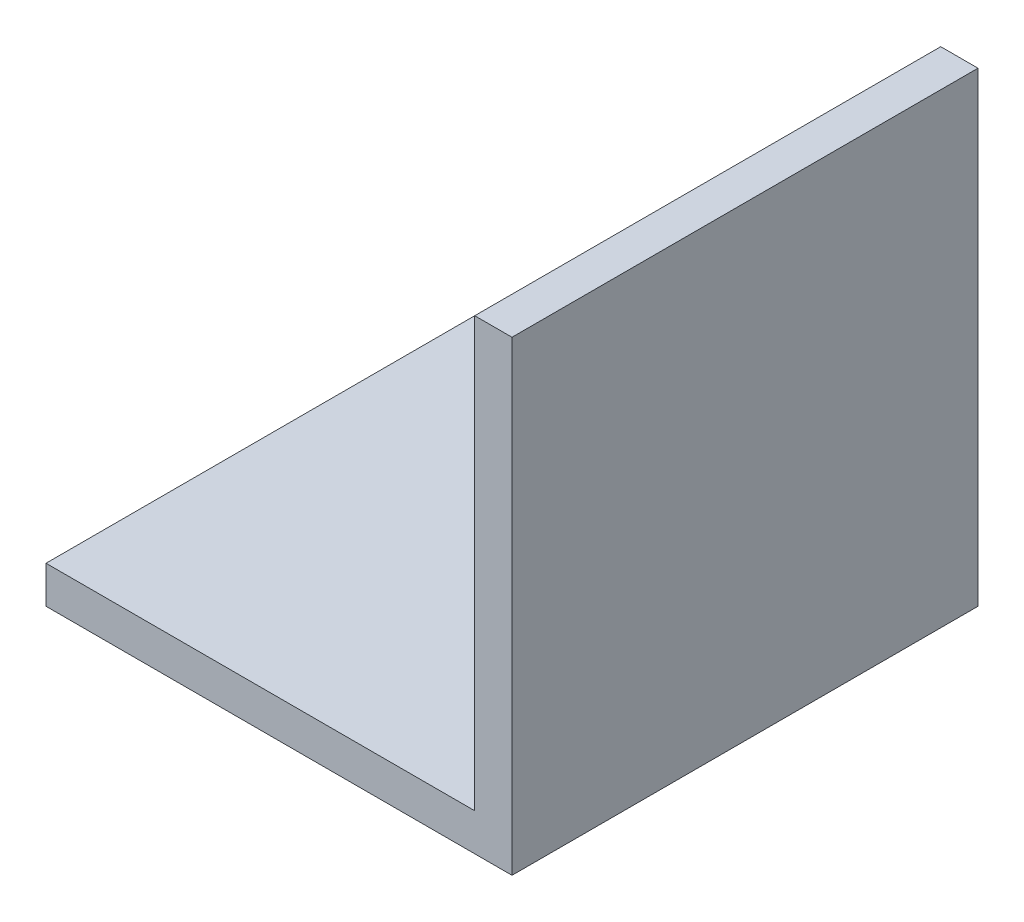
ISO-10303-21;
HEADER;
FILE_DESCRIPTION(('STEP AP214'),'2;1');
FILE_NAME('part.step','',(''),(''),'','','');
FILE_SCHEMA(('AUTOMOTIVE_DESIGN { 1 0 10303 214 1 1 1 1 }'));
ENDSEC;
DATA;
#1=APPLICATION_CONTEXT('core data for automotive mechanical design processes');
#2=APPLICATION_PROTOCOL_DEFINITION('international standard','automotive_design',2000,#1);
#3=PRODUCT_CONTEXT('',#1,'mechanical');
#4=PRODUCT('Part','Part','',(#3));
#5=PRODUCT_RELATED_PRODUCT_CATEGORY('part','',(#4));
#6=PRODUCT_DEFINITION_FORMATION('','',#4);
#7=PRODUCT_DEFINITION_CONTEXT('part definition',#1,'design');
#8=PRODUCT_DEFINITION('design','',#6,#7);
#9=PRODUCT_DEFINITION_SHAPE('','',#8);
#10=(LENGTH_UNIT() NAMED_UNIT(*) SI_UNIT(.MILLI.,.METRE.));
#11=(NAMED_UNIT(*) PLANE_ANGLE_UNIT() SI_UNIT($,.RADIAN.));
#12=(NAMED_UNIT(*) SI_UNIT($,.STERADIAN.) SOLID_ANGLE_UNIT());
#13=UNCERTAINTY_MEASURE_WITH_UNIT(LENGTH_MEASURE(1.E-05),#10,'distance_accuracy_value','');
#14=(GEOMETRIC_REPRESENTATION_CONTEXT(3) GLOBAL_UNCERTAINTY_ASSIGNED_CONTEXT((#13)) GLOBAL_UNIT_ASSIGNED_CONTEXT((#10,
#11,#12)) REPRESENTATION_CONTEXT('',''));
#15=CARTESIAN_POINT('',(0.,0.,0.));
#16=DIRECTION('',(0.,0.,1.));
#17=DIRECTION('',(1.,0.,0.));
#18=AXIS2_PLACEMENT_3D('',#15,#16,#17);
#19=CARTESIAN_POINT('',(-34.4284761465778,-3.38361242304211,50.));
#20=DIRECTION('',(1.,0.,0.));
#21=DIRECTION('',(0.,0.,-1.));
#22=AXIS2_PLACEMENT_3D('',#19,#20,#21);
#23=PLANE('',#22);
#24=DIRECTION('',(0.,-1.,0.));
#25=VECTOR('',#24,1.);
#26=CARTESIAN_POINT('',(-34.4284761465778,-3.38361242304211,0.));
#27=LINE('',#26,#25);
#28=CARTESIAN_POINT('',(-34.4284761465778,-3.38361242304211,0.));
#29=VERTEX_POINT('',#28);
#30=CARTESIAN_POINT('',(-34.4284761465778,-7.3836124230421,0.));
#31=VERTEX_POINT('',#30);
#32=EDGE_CURVE('E134',#29,#31,#27,.T.);
#33=ORIENTED_EDGE('',*,*,#32,.T.);
#34=DIRECTION('',(0.,0.,-1.));
#35=VECTOR('',#34,1.);
#36=CARTESIAN_POINT('',(-34.4284761465778,-7.3836124230421,50.));
#37=LINE('',#36,#35);
#38=CARTESIAN_POINT('',(-34.4284761465778,-7.3836124230421,50.));
#39=VERTEX_POINT('',#38);
#40=EDGE_CURVE('E11',#39,#31,#37,.T.);
#41=ORIENTED_EDGE('',*,*,#40,.F.);
#42=DIRECTION('',(0.,-1.,0.));
#43=VECTOR('',#42,1.);
#44=CARTESIAN_POINT('',(-34.4284761465778,-3.38361242304211,50.));
#45=LINE('',#44,#43);
#46=CARTESIAN_POINT('',(-34.4284761465778,-3.38361242304211,50.));
#47=VERTEX_POINT('',#46);
#48=EDGE_CURVE('E150',#47,#39,#45,.T.);
#49=ORIENTED_EDGE('',*,*,#48,.F.);
#50=DIRECTION('',(0.,0.,-1.));
#51=VECTOR('',#50,1.);
#52=CARTESIAN_POINT('',(-34.4284761465778,-3.38361242304211,50.));
#53=LINE('',#52,#51);
#54=EDGE_CURVE('E130',#47,#29,#53,.T.);
#55=ORIENTED_EDGE('',*,*,#54,.T.);
#56=EDGE_LOOP('',(#33,#41,#49,#55));
#57=FACE_BOUND('',#56,.T.);
#58=ADVANCED_FACE('F45',(#57),#23,.F.);
#59=CARTESIAN_POINT('',(-34.4284761465778,-7.3836124230421,50.));
#60=DIRECTION('',(0.,1.,0.));
#61=DIRECTION('',(0.,0.,1.));
#62=AXIS2_PLACEMENT_3D('',#59,#60,#61);
#63=PLANE('',#62);
#64=DIRECTION('',(1.,0.,0.));
#65=VECTOR('',#64,1.);
#66=CARTESIAN_POINT('',(-34.4284761465778,-7.3836124230421,0.));
#67=LINE('',#66,#65);
#68=CARTESIAN_POINT('',(15.5715238534222,-7.3836124230421,0.));
#69=VERTEX_POINT('',#68);
#70=EDGE_CURVE('E138',#31,#69,#67,.T.);
#71=ORIENTED_EDGE('',*,*,#70,.T.);
#72=DIRECTION('',(0.,0.,-1.));
#73=VECTOR('',#72,1.);
#74=CARTESIAN_POINT('',(15.5715238534222,-7.3836124230421,50.));
#75=LINE('',#74,#73);
#76=CARTESIAN_POINT('',(15.5715238534222,-7.3836124230421,50.));
#77=VERTEX_POINT('',#76);
#78=EDGE_CURVE('E54',#77,#69,#75,.T.);
#79=ORIENTED_EDGE('',*,*,#78,.F.);
#80=DIRECTION('',(1.,0.,0.));
#81=VECTOR('',#80,1.);
#82=CARTESIAN_POINT('',(-34.4284761465778,-7.3836124230421,50.));
#83=LINE('',#82,#81);
#84=EDGE_CURVE('E99',#39,#77,#83,.T.);
#85=ORIENTED_EDGE('',*,*,#84,.F.);
#86=ORIENTED_EDGE('',*,*,#40,.T.);
#87=EDGE_LOOP('',(#71,#79,#85,#86));
#88=FACE_BOUND('',#87,.T.);
#89=ADVANCED_FACE('F178',(#88),#63,.F.);
#90=CARTESIAN_POINT('',(15.5715238534222,-7.3836124230421,50.));
#91=DIRECTION('',(-1.,0.,0.));
#92=DIRECTION('',(0.,0.,1.));
#93=AXIS2_PLACEMENT_3D('',#90,#91,#92);
#94=PLANE('',#93);
#95=DIRECTION('',(0.,1.,0.));
#96=VECTOR('',#95,1.);
#97=CARTESIAN_POINT('',(15.5715238534222,-7.3836124230421,0.));
#98=LINE('',#97,#96);
#99=CARTESIAN_POINT('',(15.5715238534222,42.6163875769579,0.));
#100=VERTEX_POINT('',#99);
#101=EDGE_CURVE('E141',#69,#100,#98,.T.);
#102=ORIENTED_EDGE('',*,*,#101,.T.);
#103=DIRECTION('',(0.,0.,-1.));
#104=VECTOR('',#103,1.);
#105=CARTESIAN_POINT('',(15.5715238534222,42.6163875769579,50.));
#106=LINE('',#105,#104);
#107=CARTESIAN_POINT('',(15.5715238534222,42.6163875769579,50.));
#108=VERTEX_POINT('',#107);
#109=EDGE_CURVE('E123',#108,#100,#106,.T.);
#110=ORIENTED_EDGE('',*,*,#109,.F.);
#111=DIRECTION('',(0.,1.,0.));
#112=VECTOR('',#111,1.);
#113=CARTESIAN_POINT('',(15.5715238534222,-7.3836124230421,50.));
#114=LINE('',#113,#112);
#115=EDGE_CURVE('E112',#77,#108,#114,.T.);
#116=ORIENTED_EDGE('',*,*,#115,.F.);
#117=ORIENTED_EDGE('',*,*,#78,.T.);
#118=EDGE_LOOP('',(#102,#110,#116,#117));
#119=FACE_BOUND('',#118,.T.);
#120=ADVANCED_FACE('F160',(#119),#94,.F.);
#121=CARTESIAN_POINT('',(15.5715238534222,42.6163875769579,50.));
#122=DIRECTION('',(0.,-1.,0.));
#123=DIRECTION('',(0.,0.,-1.));
#124=AXIS2_PLACEMENT_3D('',#121,#122,#123);
#125=PLANE('',#124);
#126=DIRECTION('',(-1.,0.,0.));
#127=VECTOR('',#126,1.);
#128=CARTESIAN_POINT('',(15.5715238534222,42.6163875769579,0.));
#129=LINE('',#128,#127);
#130=CARTESIAN_POINT('',(11.5715238534222,42.6163875769579,0.));
#131=VERTEX_POINT('',#130);
#132=EDGE_CURVE('E121',#100,#131,#129,.T.);
#133=ORIENTED_EDGE('',*,*,#132,.T.);
#134=DIRECTION('',(0.,0.,-1.));
#135=VECTOR('',#134,1.);
#136=CARTESIAN_POINT('',(11.5715238534222,42.6163875769579,50.));
#137=LINE('',#136,#135);
#138=CARTESIAN_POINT('',(11.5715238534222,42.6163875769579,50.));
#139=VERTEX_POINT('',#138);
#140=EDGE_CURVE('E118',#139,#131,#137,.T.);
#141=ORIENTED_EDGE('',*,*,#140,.F.);
#142=DIRECTION('',(-1.,0.,0.));
#143=VECTOR('',#142,1.);
#144=CARTESIAN_POINT('',(15.5715238534222,42.6163875769579,50.));
#145=LINE('',#144,#143);
#146=EDGE_CURVE('E106',#108,#139,#145,.T.);
#147=ORIENTED_EDGE('',*,*,#146,.F.);
#148=ORIENTED_EDGE('',*,*,#109,.T.);
#149=EDGE_LOOP('',(#133,#141,#147,#148));
#150=FACE_BOUND('',#149,.T.);
#151=ADVANCED_FACE('F119',(#150),#125,.F.);
#152=CARTESIAN_POINT('',(11.5715238534222,-3.38361242304211,50.));
#153=DIRECTION('',(1.,0.,0.));
#154=DIRECTION('',(0.,1.,0.));
#155=AXIS2_PLACEMENT_3D('',#152,#153,#154);
#156=PLANE('',#155);
#157=DIRECTION('',(0.,-1.,0.));
#158=VECTOR('',#157,1.);
#159=CARTESIAN_POINT('',(11.5715238534222,-3.38361242304211,0.));
#160=LINE('',#159,#158);
#161=CARTESIAN_POINT('',(11.5715238534222,-3.38361242304211,0.));
#162=VERTEX_POINT('',#161);
#163=EDGE_CURVE('E85',#131,#162,#160,.T.);
#164=ORIENTED_EDGE('',*,*,#163,.T.);
#165=DIRECTION('',(0.,0.,-1.));
#166=VECTOR('',#165,1.);
#167=CARTESIAN_POINT('',(11.5715238534222,-3.38361242304211,50.));
#168=LINE('',#167,#166);
#169=CARTESIAN_POINT('',(11.5715238534222,-3.38361242304211,50.));
#170=VERTEX_POINT('',#169);
#171=EDGE_CURVE('E124',#170,#162,#168,.T.);
#172=ORIENTED_EDGE('',*,*,#171,.F.);
#173=DIRECTION('',(0.,-1.,0.));
#174=VECTOR('',#173,1.);
#175=CARTESIAN_POINT('',(11.5715238534222,-3.38361242304211,50.));
#176=LINE('',#175,#174);
#177=EDGE_CURVE('E110',#139,#170,#176,.T.);
#178=ORIENTED_EDGE('',*,*,#177,.F.);
#179=ORIENTED_EDGE('',*,*,#140,.T.);
#180=EDGE_LOOP('',(#164,#172,#178,#179));
#181=FACE_BOUND('',#180,.T.);
#182=ADVANCED_FACE('F126',(#181),#156,.F.);
#183=CARTESIAN_POINT('',(-34.4284761465778,-3.38361242304211,50.));
#184=DIRECTION('',(0.,-1.,0.));
#185=DIRECTION('',(0.,0.,-1.));
#186=AXIS2_PLACEMENT_3D('',#183,#184,#185);
#187=PLANE('',#186);
#188=DIRECTION('',(-1.,0.,0.));
#189=VECTOR('',#188,1.);
#190=CARTESIAN_POINT('',(-34.4284761465778,-3.38361242304211,0.));
#191=LINE('',#190,#189);
#192=EDGE_CURVE('E91',#162,#29,#191,.T.);
#193=ORIENTED_EDGE('',*,*,#192,.T.);
#194=ORIENTED_EDGE('',*,*,#54,.F.);
#195=DIRECTION('',(-1.,0.,0.));
#196=VECTOR('',#195,1.);
#197=CARTESIAN_POINT('',(-34.4284761465778,-3.38361242304211,50.));
#198=LINE('',#197,#196);
#199=EDGE_CURVE('E62',#170,#47,#198,.T.);
#200=ORIENTED_EDGE('',*,*,#199,.F.);
#201=ORIENTED_EDGE('',*,*,#171,.T.);
#202=EDGE_LOOP('',(#193,#194,#200,#201));
#203=FACE_BOUND('',#202,.T.);
#204=ADVANCED_FACE('F167',(#203),#187,.F.);
#205=CARTESIAN_POINT('',(0.,0.,50.));
#206=DIRECTION('',(0.,0.,1.));
#207=DIRECTION('',(1.,0.,0.));
#208=AXIS2_PLACEMENT_3D('',#205,#206,#207);
#209=PLANE('',#208);
#210=ORIENTED_EDGE('',*,*,#48,.T.);
#211=ORIENTED_EDGE('',*,*,#84,.T.);
#212=ORIENTED_EDGE('',*,*,#115,.T.);
#213=ORIENTED_EDGE('',*,*,#146,.T.);
#214=ORIENTED_EDGE('',*,*,#177,.T.);
#215=ORIENTED_EDGE('',*,*,#199,.T.);
#216=EDGE_LOOP('',(#210,#211,#212,#213,#214,#215));
#217=FACE_BOUND('',#216,.T.);
#218=ADVANCED_FACE('F108',(#217),#209,.T.);
#219=CARTESIAN_POINT('',(0.,0.,0.));
#220=DIRECTION('',(0.,0.,1.));
#221=DIRECTION('',(1.,0.,0.));
#222=AXIS2_PLACEMENT_3D('',#219,#220,#221);
#223=PLANE('',#222);
#224=ORIENTED_EDGE('',*,*,#32,.F.);
#225=ORIENTED_EDGE('',*,*,#192,.F.);
#226=ORIENTED_EDGE('',*,*,#163,.F.);
#227=ORIENTED_EDGE('',*,*,#132,.F.);
#228=ORIENTED_EDGE('',*,*,#101,.F.);
#229=ORIENTED_EDGE('',*,*,#70,.F.);
#230=EDGE_LOOP('',(#224,#225,#226,#227,#228,#229));
#231=FACE_BOUND('',#230,.T.);
#232=ADVANCED_FACE('F163',(#231),#223,.F.);
#233=CLOSED_SHELL('',(#58,#89,#120,#151,#182,#204,#218,#232));
#234=MANIFOLD_SOLID_BREP('B2',#233);
#235=ADVANCED_BREP_SHAPE_REPRESENTATION('',(#18,#234),#14);
#236=SHAPE_DEFINITION_REPRESENTATION(#9,#235);
ENDSEC;
END-ISO-10303-21;
